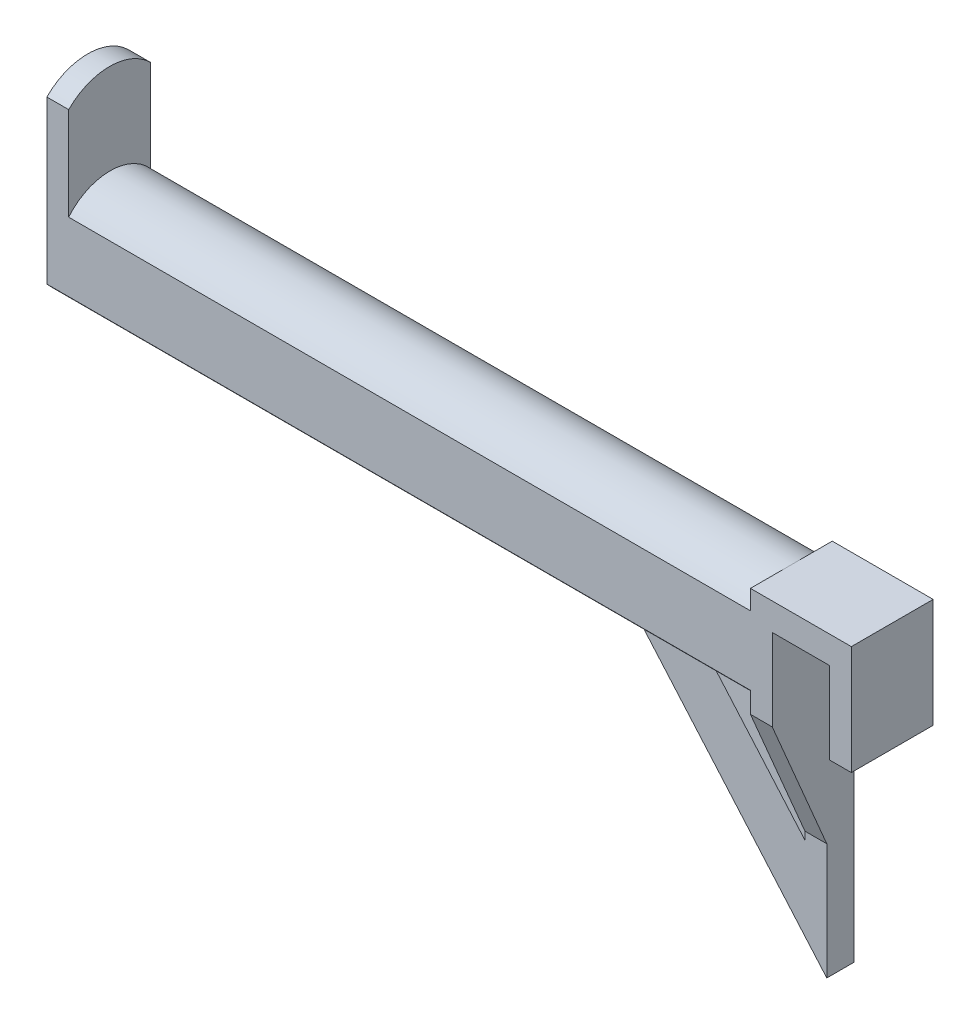
ISO-10303-21;
HEADER;
FILE_DESCRIPTION(('STEP AP214'),'2;1');
FILE_NAME('part.step','',(''),(''),'','','');
FILE_SCHEMA(('AUTOMOTIVE_DESIGN { 1 0 10303 214 1 1 1 1 }'));
ENDSEC;
DATA;
#1=APPLICATION_CONTEXT('core data for automotive mechanical design processes');
#2=APPLICATION_PROTOCOL_DEFINITION('international standard','automotive_design',2000,#1);
#3=PRODUCT_CONTEXT('',#1,'mechanical');
#4=PRODUCT('Part','Part','',(#3));
#5=PRODUCT_RELATED_PRODUCT_CATEGORY('part','',(#4));
#6=PRODUCT_DEFINITION_FORMATION('','',#4);
#7=PRODUCT_DEFINITION_CONTEXT('part definition',#1,'design');
#8=PRODUCT_DEFINITION('design','',#6,#7);
#9=PRODUCT_DEFINITION_SHAPE('','',#8);
#10=(LENGTH_UNIT() NAMED_UNIT(*) SI_UNIT(.MILLI.,.METRE.));
#11=(NAMED_UNIT(*) PLANE_ANGLE_UNIT() SI_UNIT($,.RADIAN.));
#12=(NAMED_UNIT(*) SI_UNIT($,.STERADIAN.) SOLID_ANGLE_UNIT());
#13=UNCERTAINTY_MEASURE_WITH_UNIT(LENGTH_MEASURE(1.E-05),#10,'distance_accuracy_value','');
#14=(GEOMETRIC_REPRESENTATION_CONTEXT(3) GLOBAL_UNCERTAINTY_ASSIGNED_CONTEXT((#13)) GLOBAL_UNIT_ASSIGNED_CONTEXT((#10,
#11,#12)) REPRESENTATION_CONTEXT('',''));
#15=CARTESIAN_POINT('',(0.,0.,0.));
#16=DIRECTION('',(0.,0.,1.));
#17=DIRECTION('',(1.,0.,0.));
#18=AXIS2_PLACEMENT_3D('',#15,#16,#17);
#19=CARTESIAN_POINT('',(-258.,-9.74914102080781,14.8118557656058));
#20=DIRECTION('',(1.,0.,0.));
#21=DIRECTION('',(0.,1.,0.));
#22=AXIS2_PLACEMENT_3D('',#19,#20,#21);
#23=CYLINDRICAL_SURFACE('',#22,19.7491410208078);
#24=CARTESIAN_POINT('',(-95.4312122558432,-9.74914102080779,14.8118557656058));
#25=DIRECTION('',(0.755324691246796,0.655350754018741,0.));
#26=DIRECTION('',(0.655350754018741,-0.755324691246796,0.));
#27=AXIS2_PLACEMENT_3D('',#24,#25,#26);
#28=ELLIPSE('',#27,26.1465582281023,19.7491410208078);
#29=CARTESIAN_POINT('',(-78.8124393555973,-28.9031122839886,10.));
#30=VERTEX_POINT('',#29);
#31=CARTESIAN_POINT('',(-84.0973648486006,-22.8119699578582,0.));
#32=VERTEX_POINT('',#31);
#33=EDGE_CURVE('E302',#30,#32,#28,.T.);
#34=ORIENTED_EDGE('',*,*,#33,.F.);
#35=DIRECTION('',(1.,0.,0.));
#36=VECTOR('',#35,1.);
#37=CARTESIAN_POINT('',(-258.,-28.9031122839887,10.));
#38=LINE('',#37,#36);
#39=CARTESIAN_POINT('',(-52.3337604089492,-28.9031122839886,10.));
#40=VERTEX_POINT('',#39);
#41=EDGE_CURVE('E173',#40,#30,#38,.F.);
#42=ORIENTED_EDGE('',*,*,#41,.F.);
#43=CARTESIAN_POINT('',(-68.9525333091952,-9.74914102080778,14.8118557656058));
#44=DIRECTION('',(-0.755324691246796,-0.655350754018741,0.));
#45=DIRECTION('',(0.655350754018741,-0.755324691246796,0.));
#46=AXIS2_PLACEMENT_3D('',#43,#44,#45);
#47=ELLIPSE('',#46,26.1465582281023,19.7491410208078);
#48=CARTESIAN_POINT('',(-57.6186859019526,-22.8119699578582,0.));
#49=VERTEX_POINT('',#48);
#50=EDGE_CURVE('E299',#49,#40,#47,.T.);
#51=ORIENTED_EDGE('',*,*,#50,.F.);
#52=DIRECTION('',(1.,0.,0.));
#53=VECTOR('',#52,1.);
#54=CARTESIAN_POINT('',(-258.,-22.8119699578582,0.));
#55=LINE('',#54,#53);
#56=CARTESIAN_POINT('',(-8.,-22.8119699578582,0.));
#57=VERTEX_POINT('',#56);
#58=EDGE_CURVE('E226',#49,#57,#55,.T.);
#59=ORIENTED_EDGE('',*,*,#58,.T.);
#60=CARTESIAN_POINT('',(-8.,-9.74914102080777,14.8118557656058));
#61=DIRECTION('',(-1.,0.,0.));
#62=DIRECTION('',(0.,-1.,0.));
#63=AXIS2_PLACEMENT_3D('',#60,#61,#62);
#64=CIRCLE('',#63,19.7491410208078);
#65=CARTESIAN_POINT('',(-8.,-22.3724862895942,30.));
#66=VERTEX_POINT('',#65);
#67=EDGE_CURVE('E222',#57,#66,#64,.T.);
#68=ORIENTED_EDGE('',*,*,#67,.T.);
#69=DIRECTION('',(1.,0.,0.));
#70=VECTOR('',#69,1.);
#71=CARTESIAN_POINT('',(-258.,-22.3724862895942,30.));
#72=LINE('',#71,#70);
#73=CARTESIAN_POINT('',(-266.,-22.3724862895942,30.));
#74=VERTEX_POINT('',#73);
#75=EDGE_CURVE('E241',#74,#66,#72,.T.);
#76=ORIENTED_EDGE('',*,*,#75,.F.);
#77=CARTESIAN_POINT('',(-266.,-9.74914102080781,14.8118557656058));
#78=DIRECTION('',(-1.,0.,0.));
#79=DIRECTION('',(0.,-1.,0.));
#80=AXIS2_PLACEMENT_3D('',#77,#78,#79);
#81=CIRCLE('',#80,19.7491410208078);
#82=CARTESIAN_POINT('',(-266.,-22.8119699578582,0.));
#83=VERTEX_POINT('',#82);
#84=EDGE_CURVE('E200',#83,#74,#81,.T.);
#85=ORIENTED_EDGE('',*,*,#84,.F.);
#86=EDGE_CURVE('E233',#83,#32,#55,.T.);
#87=ORIENTED_EDGE('',*,*,#86,.T.);
#88=EDGE_LOOP('',(#34,#42,#51,#59,#68,#76,#85,#87));
#89=FACE_BOUND('',#88,.T.);
#90=ADVANCED_FACE('F39',(#89),#23,.T.);
#91=CARTESIAN_POINT('',(-8.00000000000001,9.99999999999999,30.));
#92=DIRECTION('',(1.,0.,0.));
#93=DIRECTION('',(0.,1.,0.));
#94=AXIS2_PLACEMENT_3D('',#91,#92,#93);
#95=PLANE('',#94);
#96=ORIENTED_EDGE('',*,*,#67,.F.);
#97=DIRECTION('',(0.,-1.,0.));
#98=VECTOR('',#97,1.);
#99=CARTESIAN_POINT('',(-8.00000000000001,9.99999999999999,0.));
#100=LINE('',#99,#98);
#101=CARTESIAN_POINT('',(-7.99999999999999,-80.,0.));
#102=VERTEX_POINT('',#101);
#103=EDGE_CURVE('E278',#57,#102,#100,.T.);
#104=ORIENTED_EDGE('',*,*,#103,.T.);
#105=DIRECTION('',(0.,0.,-1.));
#106=VECTOR('',#105,1.);
#107=CARTESIAN_POINT('',(-7.99999999999999,-80.,10.));
#108=LINE('',#107,#106);
#109=CARTESIAN_POINT('',(-7.99999999999999,-80.,10.));
#110=VERTEX_POINT('',#109);
#111=EDGE_CURVE('E186',#110,#102,#108,.T.);
#112=ORIENTED_EDGE('',*,*,#111,.F.);
#113=DIRECTION('',(0.,-1.,0.));
#114=VECTOR('',#113,1.);
#115=CARTESIAN_POINT('',(-8.,-30.,10.));
#116=LINE('',#115,#114);
#117=CARTESIAN_POINT('',(-7.99999999999999,-77.1170473164758,10.));
#118=VERTEX_POINT('',#117);
#119=EDGE_CURVE('E189',#118,#110,#116,.T.);
#120=ORIENTED_EDGE('',*,*,#119,.F.);
#121=DIRECTION('',(0.,-0.920504853452443,-0.390731128489269));
#122=VECTOR('',#121,1.);
#123=CARTESIAN_POINT('',(-8.00000000000001,3.8931674091801,44.3867960067729));
#124=LINE('',#123,#122);
#125=CARTESIAN_POINT('',(-8.,-30.,30.));
#126=VERTEX_POINT('',#125);
#127=EDGE_CURVE('E48',#118,#126,#124,.F.);
#128=ORIENTED_EDGE('',*,*,#127,.T.);
#129=DIRECTION('',(0.,-1.,0.));
#130=VECTOR('',#129,1.);
#131=CARTESIAN_POINT('',(-8.00000000000001,9.99999999999999,30.));
#132=LINE('',#131,#130);
#133=EDGE_CURVE('E259',#66,#126,#132,.T.);
#134=ORIENTED_EDGE('',*,*,#133,.F.);
#135=EDGE_LOOP('',(#96,#104,#112,#120,#128,#134));
#136=FACE_BOUND('',#135,.T.);
#137=ADVANCED_FACE('F309',(#136),#95,.F.);
#138=CARTESIAN_POINT('',(-8.,-9.74914102080777,14.8118557656058));
#139=DIRECTION('',(-1.,0.,0.));
#140=DIRECTION('',(0.,-1.,0.));
#141=AXIS2_PLACEMENT_3D('',#138,#139,#140);
#142=CIRCLE('',#141,19.7491410208078);
#143=CARTESIAN_POINT('',(-8.,2.87420424797861,30.));
#144=VERTEX_POINT('',#143);
#145=CARTESIAN_POINT('',(-8.,9.99999999999999,14.8118557656058));
#146=VERTEX_POINT('',#145);
#147=EDGE_CURVE('E227',#144,#146,#142,.T.);
#148=ORIENTED_EDGE('',*,*,#147,.F.);
#149=CARTESIAN_POINT('',(-8.00000000000001,9.99999999999999,30.));
#150=VERTEX_POINT('',#149);
#151=EDGE_CURVE('E260',#150,#144,#132,.T.);
#152=ORIENTED_EDGE('',*,*,#151,.F.);
#153=DIRECTION('',(0.,0.,-1.));
#154=VECTOR('',#153,1.);
#155=CARTESIAN_POINT('',(-8.00000000000001,9.99999999999999,30.));
#156=LINE('',#155,#154);
#157=EDGE_CURVE('E280',#150,#146,#156,.T.);
#158=ORIENTED_EDGE('',*,*,#157,.T.);
#159=EDGE_LOOP('',(#148,#152,#158));
#160=FACE_BOUND('',#159,.T.);
#161=ADVANCED_FACE('F352',(#160),#95,.F.);
#162=CARTESIAN_POINT('',(0.,-30.,30.));
#163=DIRECTION('',(-1.,0.,0.));
#164=DIRECTION('',(0.,0.,1.));
#165=AXIS2_PLACEMENT_3D('',#162,#163,#164);
#166=PLANE('',#165);
#167=DIRECTION('',(0.,1.,0.));
#168=VECTOR('',#167,1.);
#169=CARTESIAN_POINT('',(0.,-30.,0.));
#170=LINE('',#169,#168);
#171=CARTESIAN_POINT('',(0.,-119.738410874293,0.));
#172=VERTEX_POINT('',#171);
#173=CARTESIAN_POINT('',(0.,0.,0.));
#174=VERTEX_POINT('',#173);
#175=EDGE_CURVE('E244',#172,#174,#170,.T.);
#176=ORIENTED_EDGE('',*,*,#175,.T.);
#177=DIRECTION('',(0.,0.,-1.));
#178=VECTOR('',#177,1.);
#179=CARTESIAN_POINT('',(0.,0.,30.));
#180=LINE('',#179,#178);
#181=CARTESIAN_POINT('',(0.,0.,30.));
#182=VERTEX_POINT('',#181);
#183=EDGE_CURVE('E295',#182,#174,#180,.T.);
#184=ORIENTED_EDGE('',*,*,#183,.F.);
#185=DIRECTION('',(0.,1.,0.));
#186=VECTOR('',#185,1.);
#187=CARTESIAN_POINT('',(0.,-30.,30.));
#188=LINE('',#187,#186);
#189=CARTESIAN_POINT('',(0.,-30.,30.));
#190=VERTEX_POINT('',#189);
#191=EDGE_CURVE('E245',#190,#182,#188,.T.);
#192=ORIENTED_EDGE('',*,*,#191,.F.);
#193=DIRECTION('',(0.,0.920504853452443,0.390731128489269));
#194=VECTOR('',#193,1.);
#195=CARTESIAN_POINT('',(0.,-30.,30.));
#196=LINE('',#195,#194);
#197=CARTESIAN_POINT('',(0.,-77.1170473164758,10.));
#198=VERTEX_POINT('',#197);
#199=EDGE_CURVE('E11',#190,#198,#196,.F.);
#200=ORIENTED_EDGE('',*,*,#199,.T.);
#201=DIRECTION('',(0.,1.,0.));
#202=VECTOR('',#201,1.);
#203=CARTESIAN_POINT('',(0.,-119.738410874293,10.));
#204=LINE('',#203,#202);
#205=CARTESIAN_POINT('',(0.,-119.738410874293,10.));
#206=VERTEX_POINT('',#205);
#207=EDGE_CURVE('E171',#206,#198,#204,.T.);
#208=ORIENTED_EDGE('',*,*,#207,.F.);
#209=DIRECTION('',(0.,0.,-1.));
#210=VECTOR('',#209,1.);
#211=CARTESIAN_POINT('',(0.,-119.738410874293,10.));
#212=LINE('',#211,#210);
#213=EDGE_CURVE('E180',#206,#172,#212,.T.);
#214=ORIENTED_EDGE('',*,*,#213,.T.);
#215=EDGE_LOOP('',(#176,#184,#192,#200,#208,#214));
#216=FACE_BOUND('',#215,.T.);
#217=ADVANCED_FACE('F188',(#216),#166,.F.);
#218=CARTESIAN_POINT('',(0.,0.,30.));
#219=DIRECTION('',(0.,1.,0.));
#220=DIRECTION('',(0.,0.,1.));
#221=AXIS2_PLACEMENT_3D('',#218,#219,#220);
#222=PLANE('',#221);
#223=DIRECTION('',(1.,0.,0.));
#224=VECTOR('',#223,1.);
#225=CARTESIAN_POINT('',(0.,0.,0.));
#226=LINE('',#225,#224);
#227=CARTESIAN_POINT('',(21.,0.,0.));
#228=VERTEX_POINT('',#227);
#229=EDGE_CURVE('E267',#174,#228,#226,.T.);
#230=ORIENTED_EDGE('',*,*,#229,.T.);
#231=DIRECTION('',(0.,0.,-1.));
#232=VECTOR('',#231,1.);
#233=CARTESIAN_POINT('',(21.,0.,30.));
#234=LINE('',#233,#232);
#235=CARTESIAN_POINT('',(21.,0.,30.));
#236=VERTEX_POINT('',#235);
#237=EDGE_CURVE('E292',#236,#228,#234,.T.);
#238=ORIENTED_EDGE('',*,*,#237,.F.);
#239=DIRECTION('',(1.,0.,0.));
#240=VECTOR('',#239,1.);
#241=CARTESIAN_POINT('',(0.,0.,30.));
#242=LINE('',#241,#240);
#243=EDGE_CURVE('E248',#182,#236,#242,.T.);
#244=ORIENTED_EDGE('',*,*,#243,.F.);
#245=ORIENTED_EDGE('',*,*,#183,.T.);
#246=EDGE_LOOP('',(#230,#238,#244,#245));
#247=FACE_BOUND('',#246,.T.);
#248=ADVANCED_FACE('F329',(#247),#222,.F.);
#249=CARTESIAN_POINT('',(21.,0.,30.));
#250=DIRECTION('',(1.,0.,0.));
#251=DIRECTION('',(0.,1.,0.));
#252=AXIS2_PLACEMENT_3D('',#249,#250,#251);
#253=PLANE('',#252);
#254=DIRECTION('',(0.,-1.,0.));
#255=VECTOR('',#254,1.);
#256=CARTESIAN_POINT('',(21.,0.,0.));
#257=LINE('',#256,#255);
#258=CARTESIAN_POINT('',(21.,-30.,0.));
#259=VERTEX_POINT('',#258);
#260=EDGE_CURVE('E269',#228,#259,#257,.T.);
#261=ORIENTED_EDGE('',*,*,#260,.T.);
#262=DIRECTION('',(0.,0.,-1.));
#263=VECTOR('',#262,1.);
#264=CARTESIAN_POINT('',(21.,-30.,30.));
#265=LINE('',#264,#263);
#266=CARTESIAN_POINT('',(21.,-30.,30.));
#267=VERTEX_POINT('',#266);
#268=EDGE_CURVE('E289',#267,#259,#265,.T.);
#269=ORIENTED_EDGE('',*,*,#268,.F.);
#270=DIRECTION('',(0.,-1.,0.));
#271=VECTOR('',#270,1.);
#272=CARTESIAN_POINT('',(21.,0.,30.));
#273=LINE('',#272,#271);
#274=EDGE_CURVE('E251',#236,#267,#273,.T.);
#275=ORIENTED_EDGE('',*,*,#274,.F.);
#276=ORIENTED_EDGE('',*,*,#237,.T.);
#277=EDGE_LOOP('',(#261,#269,#275,#276));
#278=FACE_BOUND('',#277,.T.);
#279=ADVANCED_FACE('F336',(#278),#253,.F.);
#280=CARTESIAN_POINT('',(21.,-30.,30.));
#281=DIRECTION('',(0.,1.,0.));
#282=DIRECTION('',(0.,0.,1.));
#283=AXIS2_PLACEMENT_3D('',#280,#281,#282);
#284=PLANE('',#283);
#285=DIRECTION('',(1.,0.,0.));
#286=VECTOR('',#285,1.);
#287=CARTESIAN_POINT('',(21.,-30.,0.));
#288=LINE('',#287,#286);
#289=CARTESIAN_POINT('',(29.,-30.,0.));
#290=VERTEX_POINT('',#289);
#291=EDGE_CURVE('E271',#259,#290,#288,.T.);
#292=ORIENTED_EDGE('',*,*,#291,.T.);
#293=DIRECTION('',(0.,0.,-1.));
#294=VECTOR('',#293,1.);
#295=CARTESIAN_POINT('',(29.,-30.,30.));
#296=LINE('',#295,#294);
#297=CARTESIAN_POINT('',(29.,-30.,30.));
#298=VERTEX_POINT('',#297);
#299=EDGE_CURVE('E286',#298,#290,#296,.T.);
#300=ORIENTED_EDGE('',*,*,#299,.F.);
#301=DIRECTION('',(1.,0.,0.));
#302=VECTOR('',#301,1.);
#303=CARTESIAN_POINT('',(21.,-30.,30.));
#304=LINE('',#303,#302);
#305=EDGE_CURVE('E253',#267,#298,#304,.T.);
#306=ORIENTED_EDGE('',*,*,#305,.F.);
#307=ORIENTED_EDGE('',*,*,#268,.T.);
#308=EDGE_LOOP('',(#292,#300,#306,#307));
#309=FACE_BOUND('',#308,.T.);
#310=ADVANCED_FACE('F339',(#309),#284,.F.);
#311=CARTESIAN_POINT('',(29.,-30.,30.));
#312=DIRECTION('',(-1.,0.,0.));
#313=DIRECTION('',(0.,0.,1.));
#314=AXIS2_PLACEMENT_3D('',#311,#312,#313);
#315=PLANE('',#314);
#316=DIRECTION('',(0.,1.,0.));
#317=VECTOR('',#316,1.);
#318=CARTESIAN_POINT('',(29.,-30.,0.));
#319=LINE('',#318,#317);
#320=CARTESIAN_POINT('',(29.,10.,0.));
#321=VERTEX_POINT('',#320);
#322=EDGE_CURVE('E273',#290,#321,#319,.T.);
#323=ORIENTED_EDGE('',*,*,#322,.T.);
#324=DIRECTION('',(0.,0.,-1.));
#325=VECTOR('',#324,1.);
#326=CARTESIAN_POINT('',(29.,10.,30.));
#327=LINE('',#326,#325);
#328=CARTESIAN_POINT('',(29.,10.,30.));
#329=VERTEX_POINT('',#328);
#330=EDGE_CURVE('E283',#329,#321,#327,.T.);
#331=ORIENTED_EDGE('',*,*,#330,.F.);
#332=DIRECTION('',(0.,1.,0.));
#333=VECTOR('',#332,1.);
#334=CARTESIAN_POINT('',(29.,-30.,30.));
#335=LINE('',#334,#333);
#336=EDGE_CURVE('E255',#298,#329,#335,.T.);
#337=ORIENTED_EDGE('',*,*,#336,.F.);
#338=ORIENTED_EDGE('',*,*,#299,.T.);
#339=EDGE_LOOP('',(#323,#331,#337,#338));
#340=FACE_BOUND('',#339,.T.);
#341=ADVANCED_FACE('F344',(#340),#315,.F.);
#342=CARTESIAN_POINT('',(29.,10.,30.));
#343=DIRECTION('',(0.,-1.,0.));
#344=DIRECTION('',(1.,0.,0.));
#345=AXIS2_PLACEMENT_3D('',#342,#343,#344);
#346=PLANE('',#345);
#347=DIRECTION('',(-1.,0.,0.));
#348=VECTOR('',#347,1.);
#349=CARTESIAN_POINT('',(29.,10.,0.));
#350=LINE('',#349,#348);
#351=CARTESIAN_POINT('',(-8.00000000000001,9.99999999999999,0.));
#352=VERTEX_POINT('',#351);
#353=EDGE_CURVE('E275',#321,#352,#350,.T.);
#354=ORIENTED_EDGE('',*,*,#353,.T.);
#355=EDGE_CURVE('E265',#146,#352,#156,.T.);
#356=ORIENTED_EDGE('',*,*,#355,.F.);
#357=ORIENTED_EDGE('',*,*,#157,.F.);
#358=DIRECTION('',(-1.,0.,0.));
#359=VECTOR('',#358,1.);
#360=CARTESIAN_POINT('',(29.,10.,30.));
#361=LINE('',#360,#359);
#362=EDGE_CURVE('E257',#329,#150,#361,.T.);
#363=ORIENTED_EDGE('',*,*,#362,.F.);
#364=ORIENTED_EDGE('',*,*,#330,.T.);
#365=EDGE_LOOP('',(#354,#356,#357,#363,#364));
#366=FACE_BOUND('',#365,.T.);
#367=ADVANCED_FACE('F350',(#366),#346,.F.);
#368=CARTESIAN_POINT('',(-8.,3.31368791624264,0.));
#369=VERTEX_POINT('',#368);
#370=EDGE_CURVE('E232',#146,#369,#142,.T.);
#371=ORIENTED_EDGE('',*,*,#370,.F.);
#372=ORIENTED_EDGE('',*,*,#355,.T.);
#373=EDGE_CURVE('E249',#352,#369,#100,.T.);
#374=ORIENTED_EDGE('',*,*,#373,.T.);
#375=EDGE_LOOP('',(#371,#372,#374));
#376=FACE_BOUND('',#375,.T.);
#377=ADVANCED_FACE('F377',(#376),#95,.F.);
#378=CARTESIAN_POINT('',(0.,0.,30.));
#379=DIRECTION('',(0.,0.,-1.));
#380=DIRECTION('',(-1.,0.,0.));
#381=AXIS2_PLACEMENT_3D('',#378,#379,#380);
#382=PLANE('',#381);
#383=ORIENTED_EDGE('',*,*,#191,.T.);
#384=ORIENTED_EDGE('',*,*,#243,.T.);
#385=ORIENTED_EDGE('',*,*,#274,.T.);
#386=ORIENTED_EDGE('',*,*,#305,.T.);
#387=ORIENTED_EDGE('',*,*,#336,.T.);
#388=ORIENTED_EDGE('',*,*,#362,.T.);
#389=ORIENTED_EDGE('',*,*,#151,.T.);
#390=DIRECTION('',(1.,0.,0.));
#391=VECTOR('',#390,1.);
#392=CARTESIAN_POINT('',(-258.,2.87420424797858,30.));
#393=LINE('',#392,#391);
#394=CARTESIAN_POINT('',(-258.,2.87420424797858,30.));
#395=VERTEX_POINT('',#394);
#396=EDGE_CURVE('E238',#395,#144,#393,.T.);
#397=ORIENTED_EDGE('',*,*,#396,.F.);
#398=DIRECTION('',(0.,1.,0.));
#399=VECTOR('',#398,1.);
#400=CARTESIAN_POINT('',(-258.,-22.3724862895942,30.));
#401=LINE('',#400,#399);
#402=CARTESIAN_POINT('',(-258.,37.0347940935435,30.));
#403=VERTEX_POINT('',#402);
#404=EDGE_CURVE('E185',#395,#403,#401,.T.);
#405=ORIENTED_EDGE('',*,*,#404,.T.);
#406=DIRECTION('',(1.,0.,0.));
#407=VECTOR('',#406,1.);
#408=CARTESIAN_POINT('',(-266.,37.0347940935435,30.));
#409=LINE('',#408,#407);
#410=CARTESIAN_POINT('',(-266.,37.0347940935435,30.));
#411=VERTEX_POINT('',#410);
#412=EDGE_CURVE('E219',#411,#403,#409,.T.);
#413=ORIENTED_EDGE('',*,*,#412,.F.);
#414=DIRECTION('',(0.,1.,0.));
#415=VECTOR('',#414,1.);
#416=CARTESIAN_POINT('',(-266.,-22.3724862895942,30.));
#417=LINE('',#416,#415);
#418=EDGE_CURVE('E203',#74,#411,#417,.T.);
#419=ORIENTED_EDGE('',*,*,#418,.F.);
#420=ORIENTED_EDGE('',*,*,#75,.T.);
#421=ORIENTED_EDGE('',*,*,#133,.T.);
#422=DIRECTION('',(1.,0.,0.));
#423=VECTOR('',#422,1.);
#424=CARTESIAN_POINT('',(-8.,-30.,30.));
#425=LINE('',#424,#423);
#426=EDGE_CURVE('E263',#126,#190,#425,.T.);
#427=ORIENTED_EDGE('',*,*,#426,.T.);
#428=EDGE_LOOP('',(#383,#384,#385,#386,#387,#388,#389,#397,#405,#413,#419,#420,#421,#427));
#429=FACE_BOUND('',#428,.T.);
#430=ADVANCED_FACE('F312',(#429),#382,.F.);
#431=CARTESIAN_POINT('',(0.,0.,0.));
#432=DIRECTION('',(0.,0.,-1.));
#433=DIRECTION('',(-1.,0.,0.));
#434=AXIS2_PLACEMENT_3D('',#431,#432,#433);
#435=PLANE('',#434);
#436=DIRECTION('',(0.655350754018741,-0.755324691246796,0.));
#437=VECTOR('',#436,1.);
#438=CARTESIAN_POINT('',(-84.4786789466481,-22.3724862895942,0.));
#439=LINE('',#438,#437);
#440=EDGE_CURVE('E183',#32,#172,#439,.T.);
#441=ORIENTED_EDGE('',*,*,#440,.F.);
#442=ORIENTED_EDGE('',*,*,#86,.F.);
#443=DIRECTION('',(0.,-1.,0.));
#444=VECTOR('',#443,1.);
#445=CARTESIAN_POINT('',(-266.,37.0347940935435,0.));
#446=LINE('',#445,#444);
#447=CARTESIAN_POINT('',(-266.,37.0347940935435,0.));
#448=VERTEX_POINT('',#447);
#449=EDGE_CURVE('E208',#448,#83,#446,.T.);
#450=ORIENTED_EDGE('',*,*,#449,.F.);
#451=DIRECTION('',(1.,0.,0.));
#452=VECTOR('',#451,1.);
#453=CARTESIAN_POINT('',(-266.,37.0347940935435,0.));
#454=LINE('',#453,#452);
#455=CARTESIAN_POINT('',(-258.,37.0347940935435,0.));
#456=VERTEX_POINT('',#455);
#457=EDGE_CURVE('E211',#448,#456,#454,.T.);
#458=ORIENTED_EDGE('',*,*,#457,.T.);
#459=DIRECTION('',(0.,-1.,0.));
#460=VECTOR('',#459,1.);
#461=CARTESIAN_POINT('',(-258.,37.0347940935435,0.));
#462=LINE('',#461,#460);
#463=CARTESIAN_POINT('',(-258.,3.31368791624261,0.));
#464=VERTEX_POINT('',#463);
#465=EDGE_CURVE('E204',#456,#464,#462,.T.);
#466=ORIENTED_EDGE('',*,*,#465,.T.);
#467=DIRECTION('',(1.,0.,0.));
#468=VECTOR('',#467,1.);
#469=CARTESIAN_POINT('',(-258.,3.31368791624261,0.));
#470=LINE('',#469,#468);
#471=EDGE_CURVE('E235',#464,#369,#470,.T.);
#472=ORIENTED_EDGE('',*,*,#471,.T.);
#473=ORIENTED_EDGE('',*,*,#373,.F.);
#474=ORIENTED_EDGE('',*,*,#353,.F.);
#475=ORIENTED_EDGE('',*,*,#322,.F.);
#476=ORIENTED_EDGE('',*,*,#291,.F.);
#477=ORIENTED_EDGE('',*,*,#260,.F.);
#478=ORIENTED_EDGE('',*,*,#229,.F.);
#479=ORIENTED_EDGE('',*,*,#175,.F.);
#480=EDGE_LOOP('',(#441,#442,#450,#458,#466,#472,#473,#474,#475,#476,#477,#478,#479));
#481=FACE_BOUND('',#480,.T.);
#482=DIRECTION('',(-0.655350754018741,0.755324691246796,0.));
#483=VECTOR('',#482,1.);
#484=CARTESIAN_POINT('',(-7.99999999999999,-80.,0.));
#485=LINE('',#484,#483);
#486=EDGE_CURVE('E176',#102,#49,#485,.T.);
#487=ORIENTED_EDGE('',*,*,#486,.F.);
#488=ORIENTED_EDGE('',*,*,#103,.F.);
#489=ORIENTED_EDGE('',*,*,#58,.F.);
#490=EDGE_LOOP('',(#487,#488,#489));
#491=FACE_BOUND('',#490,.T.);
#492=ADVANCED_FACE('F323',(#481,#491),#435,.T.);
#493=CARTESIAN_POINT('',(-258.,-9.74914102080781,14.8118557656058));
#494=DIRECTION('',(1.,0.,0.));
#495=DIRECTION('',(0.,1.,0.));
#496=AXIS2_PLACEMENT_3D('',#493,#494,#495);
#497=CYLINDRICAL_SURFACE('',#496,19.7491410208078);
#498=ORIENTED_EDGE('',*,*,#147,.T.);
#499=ORIENTED_EDGE('',*,*,#370,.T.);
#500=ORIENTED_EDGE('',*,*,#471,.F.);
#501=CARTESIAN_POINT('',(-258.,-9.74914102080781,14.8118557656058));
#502=DIRECTION('',(-1.,0.,0.));
#503=DIRECTION('',(0.,-1.,0.));
#504=AXIS2_PLACEMENT_3D('',#501,#502,#503);
#505=CIRCLE('',#504,19.7491410208078);
#506=EDGE_CURVE('E223',#395,#464,#505,.T.);
#507=ORIENTED_EDGE('',*,*,#506,.F.);
#508=ORIENTED_EDGE('',*,*,#396,.T.);
#509=EDGE_LOOP('',(#498,#499,#500,#507,#508));
#510=FACE_BOUND('',#509,.T.);
#511=ADVANCED_FACE('F355',(#510),#497,.T.);
#512=CARTESIAN_POINT('',(-266.,22.0347940935435,15.));
#513=DIRECTION('',(1.,0.,0.));
#514=DIRECTION('',(0.,1.,0.));
#515=AXIS2_PLACEMENT_3D('',#512,#513,#514);
#516=CYLINDRICAL_SURFACE('',#515,21.2132034355964);
#517=CARTESIAN_POINT('',(-258.,22.0347940935435,15.));
#518=DIRECTION('',(-1.,0.,0.));
#519=DIRECTION('',(0.,1.,0.));
#520=AXIS2_PLACEMENT_3D('',#517,#518,#519);
#521=CIRCLE('',#520,21.2132034355964);
#522=EDGE_CURVE('E213',#403,#456,#521,.T.);
#523=ORIENTED_EDGE('',*,*,#522,.T.);
#524=ORIENTED_EDGE('',*,*,#457,.F.);
#525=CARTESIAN_POINT('',(-266.,22.0347940935435,15.));
#526=DIRECTION('',(-1.,0.,0.));
#527=DIRECTION('',(0.,1.,0.));
#528=AXIS2_PLACEMENT_3D('',#525,#526,#527);
#529=CIRCLE('',#528,21.2132034355964);
#530=EDGE_CURVE('E206',#411,#448,#529,.T.);
#531=ORIENTED_EDGE('',*,*,#530,.F.);
#532=ORIENTED_EDGE('',*,*,#412,.T.);
#533=EDGE_LOOP('',(#523,#524,#531,#532));
#534=FACE_BOUND('',#533,.T.);
#535=ADVANCED_FACE('F363',(#534),#516,.T.);
#536=CARTESIAN_POINT('',(-266.,-9.74914102080781,14.8118557656058));
#537=DIRECTION('',(-1.,0.,0.));
#538=DIRECTION('',(0.,-1.,0.));
#539=AXIS2_PLACEMENT_3D('',#536,#537,#538);
#540=PLANE('',#539);
#541=ORIENTED_EDGE('',*,*,#84,.T.);
#542=ORIENTED_EDGE('',*,*,#418,.T.);
#543=ORIENTED_EDGE('',*,*,#530,.T.);
#544=ORIENTED_EDGE('',*,*,#449,.T.);
#545=EDGE_LOOP('',(#541,#542,#543,#544));
#546=FACE_BOUND('',#545,.T.);
#547=ADVANCED_FACE('F369',(#546),#540,.T.);
#548=CARTESIAN_POINT('',(-258.,-9.74914102080781,14.8118557656058));
#549=DIRECTION('',(-1.,0.,0.));
#550=DIRECTION('',(0.,-1.,0.));
#551=AXIS2_PLACEMENT_3D('',#548,#549,#550);
#552=PLANE('',#551);
#553=ORIENTED_EDGE('',*,*,#404,.F.);
#554=ORIENTED_EDGE('',*,*,#506,.T.);
#555=ORIENTED_EDGE('',*,*,#465,.F.);
#556=ORIENTED_EDGE('',*,*,#522,.F.);
#557=EDGE_LOOP('',(#553,#554,#555,#556));
#558=FACE_BOUND('',#557,.T.);
#559=ADVANCED_FACE('F366',(#558),#552,.F.);
#560=CARTESIAN_POINT('',(0.,0.,10.));
#561=DIRECTION('',(0.,0.,-1.));
#562=DIRECTION('',(-1.,0.,0.));
#563=AXIS2_PLACEMENT_3D('',#560,#561,#562);
#564=PLANE('',#563);
#565=ORIENTED_EDGE('',*,*,#207,.T.);
#566=DIRECTION('',(-1.,0.,0.));
#567=VECTOR('',#566,1.);
#568=CARTESIAN_POINT('',(-8.,-77.1170473164758,10.));
#569=LINE('',#568,#567);
#570=EDGE_CURVE('E304',#198,#118,#569,.T.);
#571=ORIENTED_EDGE('',*,*,#570,.T.);
#572=ORIENTED_EDGE('',*,*,#119,.T.);
#573=DIRECTION('',(-0.655350754018741,0.755324691246796,0.));
#574=VECTOR('',#573,1.);
#575=CARTESIAN_POINT('',(-7.99999999999999,-80.,10.));
#576=LINE('',#575,#574);
#577=EDGE_CURVE('E191',#110,#40,#576,.T.);
#578=ORIENTED_EDGE('',*,*,#577,.T.);
#579=ORIENTED_EDGE('',*,*,#41,.T.);
#580=DIRECTION('',(0.655350754018741,-0.755324691246796,0.));
#581=VECTOR('',#580,1.);
#582=CARTESIAN_POINT('',(-84.4786789466481,-22.3724862895942,10.));
#583=LINE('',#582,#581);
#584=EDGE_CURVE('E168',#30,#206,#583,.T.);
#585=ORIENTED_EDGE('',*,*,#584,.T.);
#586=EDGE_LOOP('',(#565,#571,#572,#578,#579,#585));
#587=FACE_BOUND('',#586,.T.);
#588=ADVANCED_FACE('F170',(#587),#564,.F.);
#589=CARTESIAN_POINT('',(-84.4786789466481,-22.3724862895942,10.));
#590=DIRECTION('',(0.755324691246796,0.655350754018741,0.));
#591=DIRECTION('',(-0.655350754018741,0.755324691246796,0.));
#592=AXIS2_PLACEMENT_3D('',#589,#590,#591);
#593=PLANE('',#592);
#594=ORIENTED_EDGE('',*,*,#584,.F.);
#595=ORIENTED_EDGE('',*,*,#33,.T.);
#596=ORIENTED_EDGE('',*,*,#440,.T.);
#597=ORIENTED_EDGE('',*,*,#213,.F.);
#598=EDGE_LOOP('',(#594,#595,#596,#597));
#599=FACE_BOUND('',#598,.T.);
#600=ADVANCED_FACE('F181',(#599),#593,.F.);
#601=CARTESIAN_POINT('',(-7.99999999999999,-80.,10.));
#602=DIRECTION('',(-0.755324691246796,-0.655350754018741,0.));
#603=DIRECTION('',(0.655350754018741,-0.755324691246796,0.));
#604=AXIS2_PLACEMENT_3D('',#601,#602,#603);
#605=PLANE('',#604);
#606=ORIENTED_EDGE('',*,*,#486,.T.);
#607=ORIENTED_EDGE('',*,*,#50,.T.);
#608=ORIENTED_EDGE('',*,*,#577,.F.);
#609=ORIENTED_EDGE('',*,*,#111,.T.);
#610=EDGE_LOOP('',(#606,#607,#608,#609));
#611=FACE_BOUND('',#610,.T.);
#612=ADVANCED_FACE('F318',(#611),#605,.F.);
#613=CARTESIAN_POINT('',(0.,-77.1170473164758,10.));
#614=DIRECTION('',(0.,-0.390731128489269,0.920504853452442));
#615=DIRECTION('',(1.,0.,0.));
#616=AXIS2_PLACEMENT_3D('',#613,#614,#615);
#617=PLANE('',#616);
#618=ORIENTED_EDGE('',*,*,#199,.F.);
#619=ORIENTED_EDGE('',*,*,#426,.F.);
#620=ORIENTED_EDGE('',*,*,#127,.F.);
#621=ORIENTED_EDGE('',*,*,#570,.F.);
#622=EDGE_LOOP('',(#618,#619,#620,#621));
#623=FACE_BOUND('',#622,.T.);
#624=ADVANCED_FACE('F42',(#623),#617,.T.);
#625=CLOSED_SHELL('',(#90,#137,#161,#217,#248,#279,#310,#341,#367,#377,#430,#492,#511,#535,#547,
#559,#588,#600,#612,#624));
#626=MANIFOLD_SOLID_BREP('B2',#625);
#627=ADVANCED_BREP_SHAPE_REPRESENTATION('',(#18,#626),#14);
#628=SHAPE_DEFINITION_REPRESENTATION(#9,#627);
ENDSEC;
END-ISO-10303-21;
